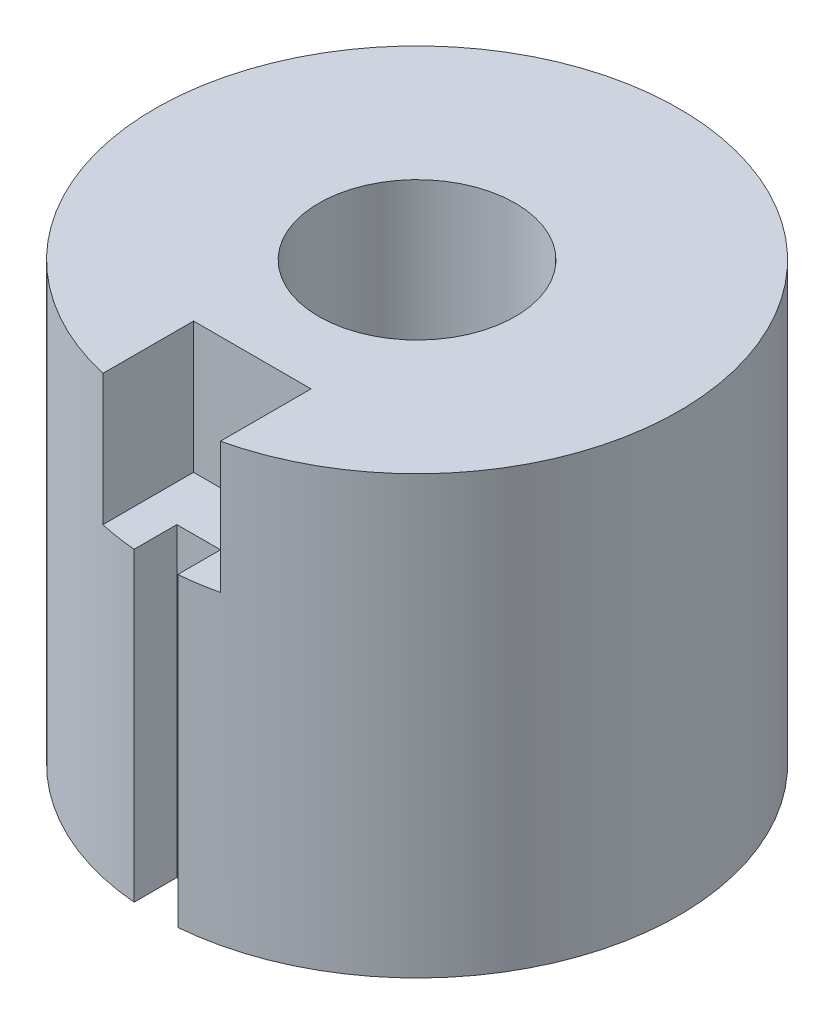
ISO-10303-21;
HEADER;
FILE_DESCRIPTION(('STEP AP214'),'2;1');
FILE_NAME('part.step','',(''),(''),'','','');
FILE_SCHEMA(('AUTOMOTIVE_DESIGN { 1 0 10303 214 1 1 1 1 }'));
ENDSEC;
DATA;
#1=APPLICATION_CONTEXT('core data for automotive mechanical design processes');
#2=APPLICATION_PROTOCOL_DEFINITION('international standard','automotive_design',2000,#1);
#3=PRODUCT_CONTEXT('',#1,'mechanical');
#4=PRODUCT('Part','Part','',(#3));
#5=PRODUCT_RELATED_PRODUCT_CATEGORY('part','',(#4));
#6=PRODUCT_DEFINITION_FORMATION('','',#4);
#7=PRODUCT_DEFINITION_CONTEXT('part definition',#1,'design');
#8=PRODUCT_DEFINITION('design','',#6,#7);
#9=PRODUCT_DEFINITION_SHAPE('','',#8);
#10=(LENGTH_UNIT() NAMED_UNIT(*) SI_UNIT(.MILLI.,.METRE.));
#11=(NAMED_UNIT(*) PLANE_ANGLE_UNIT() SI_UNIT($,.RADIAN.));
#12=(NAMED_UNIT(*) SI_UNIT($,.STERADIAN.) SOLID_ANGLE_UNIT());
#13=UNCERTAINTY_MEASURE_WITH_UNIT(LENGTH_MEASURE(1.E-05),#10,'distance_accuracy_value','');
#14=(GEOMETRIC_REPRESENTATION_CONTEXT(3) GLOBAL_UNCERTAINTY_ASSIGNED_CONTEXT((#13)) GLOBAL_UNIT_ASSIGNED_CONTEXT((#10,
#11,#12)) REPRESENTATION_CONTEXT('',''));
#15=CARTESIAN_POINT('',(0.,0.,0.));
#16=DIRECTION('',(0.,0.,1.));
#17=DIRECTION('',(1.,0.,0.));
#18=AXIS2_PLACEMENT_3D('',#15,#16,#17);
#19=CARTESIAN_POINT('',(-0.499999999999999,-10.,5.));
#20=DIRECTION('',(0.,0.,-1.));
#21=DIRECTION('',(-1.,0.,0.));
#22=AXIS2_PLACEMENT_3D('',#19,#20,#21);
#23=PLANE('',#22);
#24=DIRECTION('',(1.,0.,0.));
#25=VECTOR('',#24,1.);
#26=CARTESIAN_POINT('',(-0.499999999999999,7.,5.));
#27=LINE('',#26,#25);
#28=CARTESIAN_POINT('',(-0.499999999999999,7.,5.));
#29=VERTEX_POINT('',#28);
#30=CARTESIAN_POINT('',(0.500000000000001,7.,5.));
#31=VERTEX_POINT('',#30);
#32=EDGE_CURVE('E130',#29,#31,#27,.T.);
#33=ORIENTED_EDGE('',*,*,#32,.F.);
#34=DIRECTION('',(0.,1.,0.));
#35=VECTOR('',#34,1.);
#36=CARTESIAN_POINT('',(-0.499999999999999,-10.,5.));
#37=LINE('',#36,#35);
#38=CARTESIAN_POINT('',(-0.499999999999999,0.,5.));
#39=VERTEX_POINT('',#38);
#40=EDGE_CURVE('E136',#39,#29,#37,.T.);
#41=ORIENTED_EDGE('',*,*,#40,.F.);
#42=DIRECTION('',(-1.,0.,0.));
#43=VECTOR('',#42,1.);
#44=CARTESIAN_POINT('',(0.,0.,5.));
#45=LINE('',#44,#43);
#46=CARTESIAN_POINT('',(0.500000000000001,0.,5.));
#47=VERTEX_POINT('',#46);
#48=EDGE_CURVE('E163',#47,#39,#45,.T.);
#49=ORIENTED_EDGE('',*,*,#48,.F.);
#50=DIRECTION('',(0.,1.,0.));
#51=VECTOR('',#50,1.);
#52=CARTESIAN_POINT('',(0.500000000000001,-10.,5.));
#53=LINE('',#52,#51);
#54=EDGE_CURVE('E140',#47,#31,#53,.T.);
#55=ORIENTED_EDGE('',*,*,#54,.T.);
#56=EDGE_LOOP('',(#33,#41,#49,#55));
#57=FACE_BOUND('',#56,.T.);
#58=ADVANCED_FACE('F33',(#57),#23,.F.);
#59=CARTESIAN_POINT('',(0.500000000000001,-10.,7.));
#60=DIRECTION('',(1.,0.,0.));
#61=DIRECTION('',(0.,0.,-1.));
#62=AXIS2_PLACEMENT_3D('',#59,#60,#61);
#63=PLANE('',#62);
#64=DIRECTION('',(0.,0.,1.));
#65=VECTOR('',#64,1.);
#66=CARTESIAN_POINT('',(0.500000000000001,7.,7.));
#67=LINE('',#66,#65);
#68=CARTESIAN_POINT('',(0.500000000000001,7.,5.9791303715507));
#69=VERTEX_POINT('',#68);
#70=EDGE_CURVE('E134',#31,#69,#67,.T.);
#71=ORIENTED_EDGE('',*,*,#70,.F.);
#72=ORIENTED_EDGE('',*,*,#54,.F.);
#73=DIRECTION('',(0.,0.,-1.));
#74=VECTOR('',#73,1.);
#75=CARTESIAN_POINT('',(0.5,0.,0.));
#76=LINE('',#75,#74);
#77=CARTESIAN_POINT('',(0.500000000000001,0.,5.9791303715507));
#78=VERTEX_POINT('',#77);
#79=EDGE_CURVE('E145',#78,#47,#76,.T.);
#80=ORIENTED_EDGE('',*,*,#79,.F.);
#81=DIRECTION('',(0.,-1.,0.));
#82=VECTOR('',#81,1.);
#83=CARTESIAN_POINT('',(0.500000000000001,10.,5.9791303715507));
#84=LINE('',#83,#82);
#85=EDGE_CURVE('E56',#69,#78,#84,.T.);
#86=ORIENTED_EDGE('',*,*,#85,.F.);
#87=EDGE_LOOP('',(#71,#72,#80,#86));
#88=FACE_BOUND('',#87,.T.);
#89=ADVANCED_FACE('F186',(#88),#63,.F.);
#90=CARTESIAN_POINT('',(-0.499999999999999,-10.,7.));
#91=DIRECTION('',(-1.,0.,0.));
#92=DIRECTION('',(0.,0.,1.));
#93=AXIS2_PLACEMENT_3D('',#90,#91,#92);
#94=PLANE('',#93);
#95=DIRECTION('',(0.,0.,-1.));
#96=VECTOR('',#95,1.);
#97=CARTESIAN_POINT('',(-0.499999999999999,7.,7.));
#98=LINE('',#97,#96);
#99=CARTESIAN_POINT('',(-0.499999999999999,7.,5.9791303715507));
#100=VERTEX_POINT('',#99);
#101=EDGE_CURVE('E166',#100,#29,#98,.T.);
#102=ORIENTED_EDGE('',*,*,#101,.F.);
#103=DIRECTION('',(0.,-1.,0.));
#104=VECTOR('',#103,1.);
#105=CARTESIAN_POINT('',(-0.499999999999999,10.,5.9791303715507));
#106=LINE('',#105,#104);
#107=CARTESIAN_POINT('',(-0.499999999999999,0.,5.9791303715507));
#108=VERTEX_POINT('',#107);
#109=EDGE_CURVE('E158',#108,#100,#106,.F.);
#110=ORIENTED_EDGE('',*,*,#109,.F.);
#111=DIRECTION('',(0.,0.,1.));
#112=VECTOR('',#111,1.);
#113=CARTESIAN_POINT('',(-0.5,0.,0.));
#114=LINE('',#113,#112);
#115=EDGE_CURVE('E139',#39,#108,#114,.T.);
#116=ORIENTED_EDGE('',*,*,#115,.F.);
#117=ORIENTED_EDGE('',*,*,#40,.T.);
#118=EDGE_LOOP('',(#102,#110,#116,#117));
#119=FACE_BOUND('',#118,.T.);
#120=ADVANCED_FACE('F176',(#119),#94,.F.);
#121=CARTESIAN_POINT('',(0.,10.,0.));
#122=DIRECTION('',(0.,1.,0.));
#123=DIRECTION('',(0.,0.,1.));
#124=AXIS2_PLACEMENT_3D('',#121,#122,#123);
#125=PLANE('',#124);
#126=DIRECTION('',(0.,0.,1.));
#127=VECTOR('',#126,1.);
#128=CARTESIAN_POINT('',(-1.34532321912759,10.,6.22754580094193));
#129=LINE('',#128,#127);
#130=CARTESIAN_POINT('',(-1.34532321912759,10.,3.77245419905808));
#131=VERTEX_POINT('',#130);
#132=CARTESIAN_POINT('',(-1.34532321912759,10.,5.84723057832306));
#133=VERTEX_POINT('',#132);
#134=EDGE_CURVE('E125',#131,#133,#129,.T.);
#135=ORIENTED_EDGE('',*,*,#134,.F.);
#136=DIRECTION('',(-1.,0.,0.));
#137=VECTOR('',#136,1.);
#138=CARTESIAN_POINT('',(1.34532321912759,10.,3.77245419905808));
#139=LINE('',#138,#137);
#140=CARTESIAN_POINT('',(1.34532321912759,10.,3.77245419905808));
#141=VERTEX_POINT('',#140);
#142=EDGE_CURVE('E128',#141,#131,#139,.T.);
#143=ORIENTED_EDGE('',*,*,#142,.F.);
#144=DIRECTION('',(0.,0.,-1.));
#145=VECTOR('',#144,1.);
#146=CARTESIAN_POINT('',(1.34532321912759,10.,6.22754580094193));
#147=LINE('',#146,#145);
#148=CARTESIAN_POINT('',(1.34532321912759,10.,5.84723057832306));
#149=VERTEX_POINT('',#148);
#150=EDGE_CURVE('E114',#149,#141,#147,.T.);
#151=ORIENTED_EDGE('',*,*,#150,.F.);
#152=CARTESIAN_POINT('',(0.,10.,0.));
#153=DIRECTION('',(0.,1.,0.));
#154=DIRECTION('',(0.,0.,1.));
#155=AXIS2_PLACEMENT_3D('',#152,#153,#154);
#156=CIRCLE('',#155,6.);
#157=EDGE_CURVE('E155',#149,#133,#156,.T.);
#158=ORIENTED_EDGE('',*,*,#157,.T.);
#159=EDGE_LOOP('',(#135,#143,#151,#158));
#160=FACE_BOUND('',#159,.T.);
#161=CARTESIAN_POINT('',(0.,10.,0.));
#162=DIRECTION('',(0.,1.,0.));
#163=DIRECTION('',(0.,0.,1.));
#164=AXIS2_PLACEMENT_3D('',#161,#162,#163);
#165=CIRCLE('',#164,2.25);
#166=CARTESIAN_POINT('',(0.,10.,2.25));
#167=VERTEX_POINT('',#166);
#168=EDGE_CURVE('E149',#167,#167,#165,.T.);
#169=ORIENTED_EDGE('',*,*,#168,.F.);
#170=EDGE_LOOP('',(#169));
#171=FACE_BOUND('',#170,.T.);
#172=ADVANCED_FACE('F170',(#160,#171),#125,.T.);
#173=CARTESIAN_POINT('',(0.,0.,0.));
#174=DIRECTION('',(0.,1.,0.));
#175=DIRECTION('',(0.,0.,1.));
#176=AXIS2_PLACEMENT_3D('',#173,#174,#175);
#177=PLANE('',#176);
#178=CARTESIAN_POINT('',(0.,0.,0.));
#179=DIRECTION('',(0.,1.,0.));
#180=DIRECTION('',(0.,0.,1.));
#181=AXIS2_PLACEMENT_3D('',#178,#179,#180);
#182=CIRCLE('',#181,6.);
#183=EDGE_CURVE('E152',#78,#108,#182,.T.);
#184=ORIENTED_EDGE('',*,*,#183,.F.);
#185=ORIENTED_EDGE('',*,*,#79,.T.);
#186=ORIENTED_EDGE('',*,*,#48,.T.);
#187=ORIENTED_EDGE('',*,*,#115,.T.);
#188=EDGE_LOOP('',(#184,#185,#186,#187));
#189=FACE_BOUND('',#188,.T.);
#190=CARTESIAN_POINT('',(0.,0.,0.));
#191=DIRECTION('',(0.,1.,0.));
#192=DIRECTION('',(0.,0.,1.));
#193=AXIS2_PLACEMENT_3D('',#190,#191,#192);
#194=CIRCLE('',#193,2.25);
#195=CARTESIAN_POINT('',(0.,0.,2.25));
#196=VERTEX_POINT('',#195);
#197=EDGE_CURVE('E148',#196,#196,#194,.T.);
#198=ORIENTED_EDGE('',*,*,#197,.T.);
#199=EDGE_LOOP('',(#198));
#200=FACE_BOUND('',#199,.T.);
#201=ADVANCED_FACE('F179',(#189,#200),#177,.F.);
#202=CARTESIAN_POINT('',(0.,10.,0.));
#203=DIRECTION('',(0.,-1.,0.));
#204=DIRECTION('',(0.,0.,-1.));
#205=AXIS2_PLACEMENT_3D('',#202,#203,#204);
#206=CYLINDRICAL_SURFACE('',#205,6.);
#207=CARTESIAN_POINT('',(0.,7.,0.));
#208=DIRECTION('',(0.,1.,0.));
#209=DIRECTION('',(0.,0.,1.));
#210=AXIS2_PLACEMENT_3D('',#207,#208,#209);
#211=CIRCLE('',#210,6.);
#212=CARTESIAN_POINT('',(-1.34532321912759,7.,5.84723057832306));
#213=VERTEX_POINT('',#212);
#214=EDGE_CURVE('E48',#213,#100,#211,.T.);
#215=ORIENTED_EDGE('',*,*,#214,.F.);
#216=DIRECTION('',(0.,-1.,0.));
#217=VECTOR('',#216,1.);
#218=CARTESIAN_POINT('',(-1.34532321912759,10.,5.84723057832306));
#219=LINE('',#218,#217);
#220=EDGE_CURVE('E11',#213,#133,#219,.F.);
#221=ORIENTED_EDGE('',*,*,#220,.T.);
#222=ORIENTED_EDGE('',*,*,#157,.F.);
#223=DIRECTION('',(0.,-1.,0.));
#224=VECTOR('',#223,1.);
#225=CARTESIAN_POINT('',(1.34532321912759,10.,5.84723057832306));
#226=LINE('',#225,#224);
#227=CARTESIAN_POINT('',(1.34532321912759,7.,5.84723057832306));
#228=VERTEX_POINT('',#227);
#229=EDGE_CURVE('E41',#149,#228,#226,.T.);
#230=ORIENTED_EDGE('',*,*,#229,.T.);
#231=EDGE_CURVE('E105',#69,#228,#211,.T.);
#232=ORIENTED_EDGE('',*,*,#231,.F.);
#233=ORIENTED_EDGE('',*,*,#85,.T.);
#234=ORIENTED_EDGE('',*,*,#183,.T.);
#235=ORIENTED_EDGE('',*,*,#109,.T.);
#236=EDGE_LOOP('',(#215,#221,#222,#230,#232,#233,#234,#235));
#237=FACE_BOUND('',#236,.T.);
#238=ADVANCED_FACE('F35',(#237),#206,.T.);
#239=CARTESIAN_POINT('',(0.,10.,0.));
#240=DIRECTION('',(0.,-1.,0.));
#241=DIRECTION('',(0.,0.,-1.));
#242=AXIS2_PLACEMENT_3D('',#239,#240,#241);
#243=CYLINDRICAL_SURFACE('',#242,2.25);
#244=ORIENTED_EDGE('',*,*,#168,.T.);
#245=EDGE_LOOP('',(#244));
#246=FACE_BOUND('',#245,.T.);
#247=ORIENTED_EDGE('',*,*,#197,.F.);
#248=EDGE_LOOP('',(#247));
#249=FACE_BOUND('',#248,.T.);
#250=ADVANCED_FACE('F196',(#246,#249),#243,.F.);
#251=CARTESIAN_POINT('',(-1.34532321912759,7.,6.22754580094193));
#252=DIRECTION('',(-1.,0.,0.));
#253=DIRECTION('',(0.,0.,1.));
#254=AXIS2_PLACEMENT_3D('',#251,#252,#253);
#255=PLANE('',#254);
#256=DIRECTION('',(0.,0.,1.));
#257=VECTOR('',#256,1.);
#258=CARTESIAN_POINT('',(-1.34532321912759,7.,6.22754580094193));
#259=LINE('',#258,#257);
#260=CARTESIAN_POINT('',(-1.34532321912759,7.,3.77245419905808));
#261=VERTEX_POINT('',#260);
#262=EDGE_CURVE('E108',#261,#213,#259,.T.);
#263=ORIENTED_EDGE('',*,*,#262,.F.);
#264=DIRECTION('',(0.,1.,0.));
#265=VECTOR('',#264,1.);
#266=CARTESIAN_POINT('',(-1.34532321912759,7.,3.77245419905808));
#267=LINE('',#266,#265);
#268=EDGE_CURVE('E118',#261,#131,#267,.T.);
#269=ORIENTED_EDGE('',*,*,#268,.T.);
#270=ORIENTED_EDGE('',*,*,#134,.T.);
#271=ORIENTED_EDGE('',*,*,#220,.F.);
#272=EDGE_LOOP('',(#263,#269,#270,#271));
#273=FACE_BOUND('',#272,.T.);
#274=ADVANCED_FACE('F173',(#273),#255,.F.);
#275=CARTESIAN_POINT('',(1.34532321912759,7.,6.22754580094193));
#276=DIRECTION('',(1.,0.,0.));
#277=DIRECTION('',(0.,0.,-1.));
#278=AXIS2_PLACEMENT_3D('',#275,#276,#277);
#279=PLANE('',#278);
#280=ORIENTED_EDGE('',*,*,#150,.T.);
#281=DIRECTION('',(0.,1.,0.));
#282=VECTOR('',#281,1.);
#283=CARTESIAN_POINT('',(1.34532321912759,7.,3.77245419905808));
#284=LINE('',#283,#282);
#285=CARTESIAN_POINT('',(1.34532321912759,7.,3.77245419905808));
#286=VERTEX_POINT('',#285);
#287=EDGE_CURVE('E111',#286,#141,#284,.T.);
#288=ORIENTED_EDGE('',*,*,#287,.F.);
#289=DIRECTION('',(0.,0.,-1.));
#290=VECTOR('',#289,1.);
#291=CARTESIAN_POINT('',(1.34532321912759,7.,6.22754580094193));
#292=LINE('',#291,#290);
#293=EDGE_CURVE('E100',#228,#286,#292,.T.);
#294=ORIENTED_EDGE('',*,*,#293,.F.);
#295=ORIENTED_EDGE('',*,*,#229,.F.);
#296=EDGE_LOOP('',(#280,#288,#294,#295));
#297=FACE_BOUND('',#296,.T.);
#298=ADVANCED_FACE('F112',(#297),#279,.F.);
#299=CARTESIAN_POINT('',(0.,7.,0.));
#300=DIRECTION('',(0.,1.,0.));
#301=DIRECTION('',(0.,0.,1.));
#302=AXIS2_PLACEMENT_3D('',#299,#300,#301);
#303=PLANE('',#302);
#304=ORIENTED_EDGE('',*,*,#231,.T.);
#305=ORIENTED_EDGE('',*,*,#293,.T.);
#306=DIRECTION('',(-1.,0.,0.));
#307=VECTOR('',#306,1.);
#308=CARTESIAN_POINT('',(1.34532321912759,7.,3.77245419905808));
#309=LINE('',#308,#307);
#310=EDGE_CURVE('E104',#286,#261,#309,.T.);
#311=ORIENTED_EDGE('',*,*,#310,.T.);
#312=ORIENTED_EDGE('',*,*,#262,.T.);
#313=ORIENTED_EDGE('',*,*,#214,.T.);
#314=ORIENTED_EDGE('',*,*,#101,.T.);
#315=ORIENTED_EDGE('',*,*,#32,.T.);
#316=ORIENTED_EDGE('',*,*,#70,.T.);
#317=EDGE_LOOP('',(#304,#305,#311,#312,#313,#314,#315,#316));
#318=FACE_BOUND('',#317,.T.);
#319=ADVANCED_FACE('F102',(#318),#303,.T.);
#320=CARTESIAN_POINT('',(1.34532321912759,7.,3.77245419905808));
#321=DIRECTION('',(0.,0.,-1.));
#322=DIRECTION('',(-1.,0.,0.));
#323=AXIS2_PLACEMENT_3D('',#320,#321,#322);
#324=PLANE('',#323);
#325=ORIENTED_EDGE('',*,*,#142,.T.);
#326=ORIENTED_EDGE('',*,*,#268,.F.);
#327=ORIENTED_EDGE('',*,*,#310,.F.);
#328=ORIENTED_EDGE('',*,*,#287,.T.);
#329=EDGE_LOOP('',(#325,#326,#327,#328));
#330=FACE_BOUND('',#329,.T.);
#331=ADVANCED_FACE('F120',(#330),#324,.F.);
#332=CLOSED_SHELL('',(#58,#89,#120,#172,#201,#238,#250,#274,#298,#319,#331));
#333=MANIFOLD_SOLID_BREP('B2',#332);
#334=ADVANCED_BREP_SHAPE_REPRESENTATION('',(#18,#333),#14);
#335=SHAPE_DEFINITION_REPRESENTATION(#9,#334);
ENDSEC;
END-ISO-10303-21;
